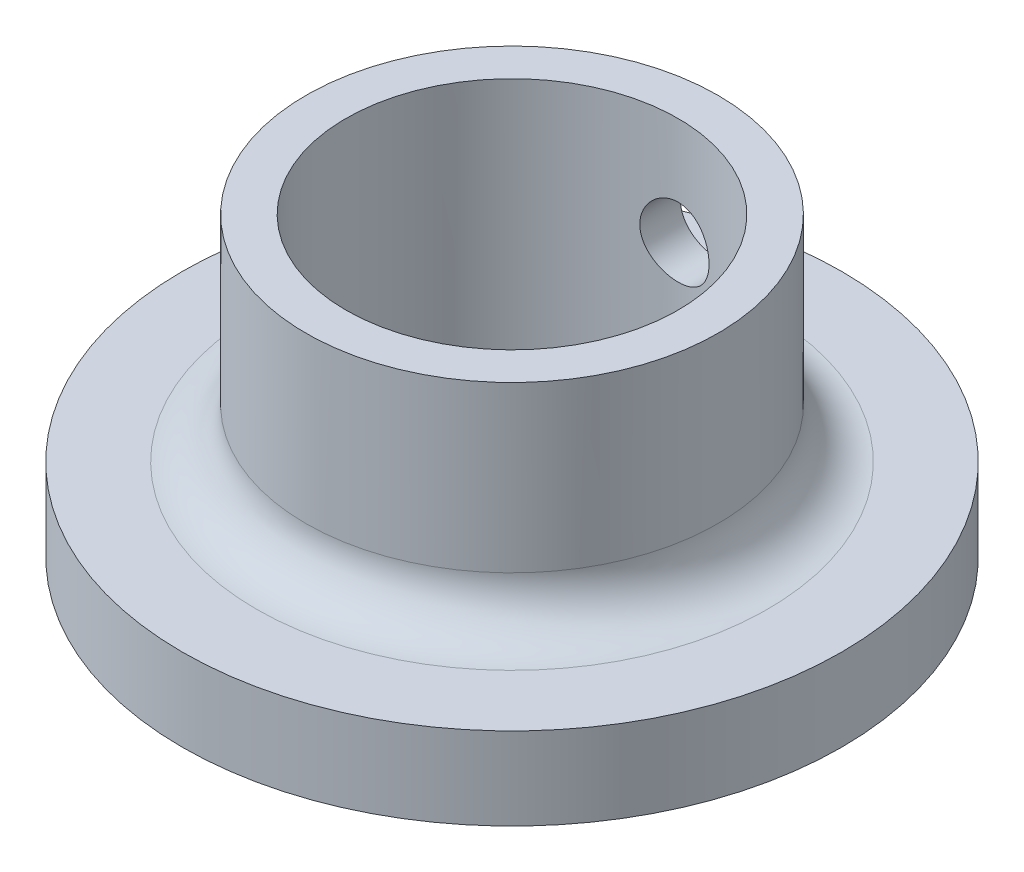
ISO-10303-21;
HEADER;
FILE_DESCRIPTION(('STEP AP214'),'2;1');
FILE_NAME('part.step','',(''),(''),'','','');
FILE_SCHEMA(('AUTOMOTIVE_DESIGN { 1 0 10303 214 1 1 1 1 }'));
ENDSEC;
DATA;
#1=APPLICATION_CONTEXT('core data for automotive mechanical design processes');
#2=APPLICATION_PROTOCOL_DEFINITION('international standard','automotive_design',2000,#1);
#3=PRODUCT_CONTEXT('',#1,'mechanical');
#4=PRODUCT('Part','Part','',(#3));
#5=PRODUCT_RELATED_PRODUCT_CATEGORY('part','',(#4));
#6=PRODUCT_DEFINITION_FORMATION('','',#4);
#7=PRODUCT_DEFINITION_CONTEXT('part definition',#1,'design');
#8=PRODUCT_DEFINITION('design','',#6,#7);
#9=PRODUCT_DEFINITION_SHAPE('','',#8);
#10=(LENGTH_UNIT() NAMED_UNIT(*) SI_UNIT(.MILLI.,.METRE.));
#11=(NAMED_UNIT(*) PLANE_ANGLE_UNIT() SI_UNIT($,.RADIAN.));
#12=(NAMED_UNIT(*) SI_UNIT($,.STERADIAN.) SOLID_ANGLE_UNIT());
#13=UNCERTAINTY_MEASURE_WITH_UNIT(LENGTH_MEASURE(1.E-05),#10,'distance_accuracy_value','');
#14=(GEOMETRIC_REPRESENTATION_CONTEXT(3) GLOBAL_UNCERTAINTY_ASSIGNED_CONTEXT((#13)) GLOBAL_UNIT_ASSIGNED_CONTEXT((#10,
#11,#12)) REPRESENTATION_CONTEXT('',''));
#15=CARTESIAN_POINT('',(0.,0.,0.));
#16=DIRECTION('',(0.,0.,1.));
#17=DIRECTION('',(1.,0.,0.));
#18=AXIS2_PLACEMENT_3D('',#15,#16,#17);
#19=CARTESIAN_POINT('',(0.,0.,0.));
#20=DIRECTION('',(0.,-1.,0.));
#21=DIRECTION('',(0.,0.,-1.));
#22=AXIS2_PLACEMENT_3D('',#19,#20,#21);
#23=PLANE('',#22);
#24=CARTESIAN_POINT('',(0.,0.,0.));
#25=DIRECTION('',(0.,-1.,0.));
#26=DIRECTION('',(0.,0.,-1.));
#27=AXIS2_PLACEMENT_3D('',#24,#25,#26);
#28=CIRCLE('',#27,12.075);
#29=CARTESIAN_POINT('',(0.,0.,-12.075));
#30=VERTEX_POINT('',#29);
#31=EDGE_CURVE('E49',#30,#30,#28,.F.);
#32=ORIENTED_EDGE('',*,*,#31,.T.);
#33=EDGE_LOOP('',(#32));
#34=FACE_BOUND('',#33,.T.);
#35=CARTESIAN_POINT('',(0.,0.,0.));
#36=DIRECTION('',(0.,-1.,0.));
#37=DIRECTION('',(0.,0.,-1.));
#38=AXIS2_PLACEMENT_3D('',#35,#36,#37);
#39=CIRCLE('',#38,20.);
#40=CARTESIAN_POINT('',(0.,0.,-20.));
#41=VERTEX_POINT('',#40);
#42=EDGE_CURVE('E62',#41,#41,#39,.T.);
#43=ORIENTED_EDGE('',*,*,#42,.T.);
#44=EDGE_LOOP('',(#43));
#45=FACE_BOUND('',#44,.T.);
#46=ADVANCED_FACE('F41',(#34,#45),#23,.T.);
#47=CARTESIAN_POINT('',(0.,0.,0.));
#48=DIRECTION('',(0.,-1.,0.));
#49=DIRECTION('',(0.,0.,-1.));
#50=AXIS2_PLACEMENT_3D('',#47,#48,#49);
#51=CYLINDRICAL_SURFACE('',#50,20.);
#52=CARTESIAN_POINT('',(0.,5.,0.));
#53=DIRECTION('',(0.,-1.,0.));
#54=DIRECTION('',(0.,0.,-1.));
#55=AXIS2_PLACEMENT_3D('',#52,#53,#54);
#56=CIRCLE('',#55,20.);
#57=CARTESIAN_POINT('',(0.,5.,-20.));
#58=VERTEX_POINT('',#57);
#59=EDGE_CURVE('E118',#58,#58,#56,.T.);
#60=ORIENTED_EDGE('',*,*,#59,.T.);
#61=EDGE_LOOP('',(#60));
#62=FACE_BOUND('',#61,.T.);
#63=ORIENTED_EDGE('',*,*,#42,.F.);
#64=EDGE_LOOP('',(#63));
#65=FACE_BOUND('',#64,.T.);
#66=ADVANCED_FACE('F100',(#62,#65),#51,.T.);
#67=CARTESIAN_POINT('',(20.,5.,0.));
#68=DIRECTION('',(0.,1.,0.));
#69=DIRECTION('',(0.,0.,1.));
#70=AXIS2_PLACEMENT_3D('',#67,#68,#69);
#71=PLANE('',#70);
#72=CARTESIAN_POINT('',(0.,5.,0.));
#73=DIRECTION('',(0.,1.,0.));
#74=DIRECTION('',(0.,0.,1.));
#75=AXIS2_PLACEMENT_3D('',#72,#73,#74);
#76=CIRCLE('',#75,15.5);
#77=CARTESIAN_POINT('',(0.,5.,15.5));
#78=VERTEX_POINT('',#77);
#79=EDGE_CURVE('E57',#78,#78,#76,.F.);
#80=ORIENTED_EDGE('',*,*,#79,.T.);
#81=EDGE_LOOP('',(#80));
#82=FACE_BOUND('',#81,.T.);
#83=ORIENTED_EDGE('',*,*,#59,.F.);
#84=EDGE_LOOP('',(#83));
#85=FACE_BOUND('',#84,.T.);
#86=ADVANCED_FACE('F96',(#82,#85),#71,.T.);
#87=CARTESIAN_POINT('',(0.,0.,0.));
#88=DIRECTION('',(0.,-1.,0.));
#89=DIRECTION('',(0.,0.,-1.));
#90=AXIS2_PLACEMENT_3D('',#87,#88,#89);
#91=CYLINDRICAL_SURFACE('',#90,12.5);
#92=CARTESIAN_POINT('',(0.,8.,0.));
#93=DIRECTION('',(0.,1.,0.));
#94=DIRECTION('',(0.,0.,1.));
#95=AXIS2_PLACEMENT_3D('',#92,#93,#94);
#96=CIRCLE('',#95,12.5);
#97=CARTESIAN_POINT('',(0.,8.,12.5));
#98=VERTEX_POINT('',#97);
#99=EDGE_CURVE('E53',#98,#98,#96,.T.);
#100=ORIENTED_EDGE('',*,*,#99,.T.);
#101=EDGE_LOOP('',(#100));
#102=FACE_BOUND('',#101,.T.);
#103=CARTESIAN_POINT('',(0.,13.6,-12.5));
#104=CARTESIAN_POINT('',(0.117074540941583,13.5999953180553,-12.4999979850335));
#105=CARTESIAN_POINT('',(0.234212632199716,13.5901766069683,-12.4983381029509));
#106=CARTESIAN_POINT('',(0.465202514145649,13.5511780612859,-12.4918763522327));
#107=CARTESIAN_POINT('',(0.579051198376305,13.5219805116302,-12.4870716087948));
#108=CARTESIAN_POINT('',(0.800086977510911,13.4451315244666,-12.4748589634518));
#109=CARTESIAN_POINT('',(0.907279472218549,13.3974952783633,-12.4674532049535));
#110=CARTESIAN_POINT('',(1.11213678255482,13.2851610984036,-12.4508524755487));
#111=CARTESIAN_POINT('',(1.20980266668286,13.220465080983,-12.4416577056439));
#112=CARTESIAN_POINT('',(1.39379587010546,13.0751798744619,-12.4223981889712));
#113=CARTESIAN_POINT('',(1.48001729912585,12.9944574787781,-12.4123265773946));
#114=CARTESIAN_POINT('',(1.63775931412675,12.8196976324397,-12.3925009568141));
#115=CARTESIAN_POINT('',(1.70927896467095,12.7256593351712,-12.3827469680529));
#116=CARTESIAN_POINT('',(1.83601257169018,12.5262084324141,-12.364594470401));
#117=CARTESIAN_POINT('',(1.89112163656496,12.4207282998381,-12.3562048303615));
#118=CARTESIAN_POINT('',(1.98279891820649,12.2018435893746,-12.3418262562123));
#119=CARTESIAN_POINT('',(2.01936840805618,12.0884395562172,-12.3358371572672));
#120=CARTESIAN_POINT('',(2.0725944628126,11.8580492702142,-12.3270061457285));
#121=CARTESIAN_POINT('',(2.08943395176936,11.7411064059694,-12.3241353407531));
#122=CARTESIAN_POINT('',(2.10328918829526,11.5060224491766,-12.3217785743232));
#123=CARTESIAN_POINT('',(2.10030636130359,11.3878814433981,-12.3222923694792));
#124=CARTESIAN_POINT('',(2.07475059430712,11.1550617794737,-12.3266203766948));
#125=CARTESIAN_POINT('',(2.05238329577848,11.0403598109225,-12.3303999423564));
#126=CARTESIAN_POINT('',(1.98901630209222,10.8163601313339,-12.3407793831826));
#127=CARTESIAN_POINT('',(1.94801595853479,10.7070626085093,-12.3473793564923));
#128=CARTESIAN_POINT('',(1.8483386819589,10.4963595962553,-12.3626933139212));
#129=CARTESIAN_POINT('',(1.78957649916276,10.394995204354,-12.3714174530176));
#130=CARTESIAN_POINT('',(1.65610409912047,10.2034875221293,-12.3899897206694));
#131=CARTESIAN_POINT('',(1.5813925744949,10.113345152643,-12.3998379413357));
#132=CARTESIAN_POINT('',(1.41702255109378,9.94565011086374,-12.4197008820721));
#133=CARTESIAN_POINT('',(1.32718764769097,9.86827030463231,-12.4297161369439));
#134=CARTESIAN_POINT('',(1.13571717625562,9.72965682310529,-12.4486700613777));
#135=CARTESIAN_POINT('',(1.03408152991189,9.66842325496697,-12.4576087237945));
#136=CARTESIAN_POINT('',(0.821731019759832,9.56382412734602,-12.4734153178499));
#137=CARTESIAN_POINT('',(0.711008411458567,9.52047400292406,-12.4802814593463));
#138=CARTESIAN_POINT('',(0.48371291150413,9.45303360779582,-12.4911550424803));
#139=CARTESIAN_POINT('',(0.367140518112909,9.42894169969883,-12.4951627271492));
#140=CARTESIAN_POINT('',(0.132944289836902,9.40093633942355,-12.4998351161996));
#141=CARTESIAN_POINT('',(0.0153495862377751,9.39678560538175,-12.5005391289215));
#142=CARTESIAN_POINT('',(-0.218854906058311,9.40814757931273,-12.4986325690543));
#143=CARTESIAN_POINT('',(-0.335464733102161,9.42365951811877,-12.4960221261204));
#144=CARTESIAN_POINT('',(-0.563655234102345,9.47370915788391,-12.4878043154549));
#145=CARTESIAN_POINT('',(-0.675262433579276,9.50812922786493,-12.4822154831937));
#146=CARTESIAN_POINT('',(-0.891122190274724,9.59489255685242,-12.4686650466383));
#147=CARTESIAN_POINT('',(-0.995374328589462,9.64723683573086,-12.460703307331));
#148=CARTESIAN_POINT('',(-1.19459420437315,9.7689050596984,-12.4431927503219));
#149=CARTESIAN_POINT('',(-1.2894703229513,9.83837702823736,-12.4336303436623));
#150=CARTESIAN_POINT('',(-1.4663024554819,9.99212515760819,-12.4140197746289));
#151=CARTESIAN_POINT('',(-1.54825751409132,10.0764024121238,-12.4039715764089));
#152=CARTESIAN_POINT('',(-1.69780202073456,10.2584336184309,-12.3843946149788));
#153=CARTESIAN_POINT('',(-1.76523104961379,10.3563201802091,-12.3748724383905));
#154=CARTESIAN_POINT('',(-1.8826886150887,10.5621702425911,-12.3575492411171));
#155=CARTESIAN_POINT('',(-1.93271770964875,10.6701334199269,-12.3497481652444));
#156=CARTESIAN_POINT('',(-2.01371609544458,10.8926260012722,-12.3367999967244));
#157=CARTESIAN_POINT('',(-2.04476485036559,11.0071258043437,-12.3316418539891));
#158=CARTESIAN_POINT('',(-2.08717097092275,11.2398095442261,-12.3245360007327));
#159=CARTESIAN_POINT('',(-2.09853007872247,11.3579931541474,-12.3225880061746));
#160=CARTESIAN_POINT('',(-2.10118528184685,11.5930875183413,-12.3221353831586));
#161=CARTESIAN_POINT('',(-2.09273391533625,11.7099954135861,-12.3235874119411));
#162=CARTESIAN_POINT('',(-2.05655455745537,11.9407004981614,-12.3296761691342));
#163=CARTESIAN_POINT('',(-2.028826631474,12.0544976980426,-12.3343128867418));
#164=CARTESIAN_POINT('',(-1.95497860021921,12.2756511249877,-12.3462319999713));
#165=CARTESIAN_POINT('',(-1.90888057961073,12.3830149087036,-12.3535112178275));
#166=CARTESIAN_POINT('',(-1.79962695250782,12.5885255764082,-12.3698981728838));
#167=CARTESIAN_POINT('',(-1.73647047773233,12.6866719908868,-12.3790060031548));
#168=CARTESIAN_POINT('',(-1.59399285529132,12.872237142184,-12.3981611953516));
#169=CARTESIAN_POINT('',(-1.51448603722987,12.9595123088002,-12.4082185589356));
#170=CARTESIAN_POINT('',(-1.34195587892342,13.1195686547091,-12.4280601392207));
#171=CARTESIAN_POINT('',(-1.24892942498316,13.1923464859549,-12.4378442923783));
#172=CARTESIAN_POINT('',(-1.05122315900057,13.321810428653,-12.4561167915784));
#173=CARTESIAN_POINT('',(-0.946466039067368,13.3783798479589,-12.4645955470165));
#174=CARTESIAN_POINT('',(-0.728835605277911,13.4730308602137,-12.4792085834535));
#175=CARTESIAN_POINT('',(-0.615970475427854,13.5111308028771,-12.4853451901191));
#176=CARTESIAN_POINT('',(-0.41889415955467,13.5595239328767,-12.4932486661438));
#177=CARTESIAN_POINT('',(-0.335872891380583,13.5746780510896,-12.4957668377763));
#178=CARTESIAN_POINT('',(-0.168578718714729,13.5949176814824,-12.4991432155384));
#179=CARTESIAN_POINT('',(-0.0843058363549362,13.6000033714867,-12.5000014509853));
#180=CARTESIAN_POINT('',(0.,13.6,-12.5));
#181=B_SPLINE_CURVE_WITH_KNOTS('',3,(#103,#104,#105,#106,#107,#108,#109,#110,#111,#112,#113,
#114,#115,#116,#117,#118,#119,#120,#121,#122,#123,#124,#125,#126,#127,#128,#129,#130,#131,#132,
#133,#134,#135,#136,#137,#138,#139,#140,#141,#142,#143,#144,#145,#146,#147,#148,#149,#150,#151,
#152,#153,#154,#155,#156,#157,#158,#159,#160,#161,#162,#163,#164,#165,#166,#167,#168,#169,#170,
#171,#172,#173,#174,#175,#176,#177,#178,#179,#180),.UNSPECIFIED.,.T.,.F.,(4,2,2,2,2,2,2,2,2,2,2,
2,2,2,2,2,2,2,2,2,2,2,2,2,2,2,2,2,2,2,2,2,2,2,2,2,2,2,4),(0.,0.35091545150206,0.702152133103424,
1.05310004916493,1.4040085577314,1.75796599821148,2.11194595312561,2.46814213683526,
2.8243138578092,3.17715657348286,3.52997391621859,3.87909356289096,4.22822535929209,
4.57906019983617,4.92992380962344,5.28520652717862,5.64049160256887,5.99608268340195,
6.35164352760911,6.70296286172151,7.05426845330718,7.40341286029033,7.75257713658976,
8.10487183858148,8.45719257594607,8.81322460865947,9.16924522342731,9.52376491632597,
9.87825323929572,10.2282472685808,10.5782401106406,10.9278134519676,11.2774045900494,
11.6312096518684,11.9850963277263,12.3414702192176,12.6974893182942,12.9501893751033,
13.2028849687893),.UNSPECIFIED.);
#182=CARTESIAN_POINT('',(0.,13.6,-12.5));
#183=VERTEX_POINT('',#182);
#184=EDGE_CURVE('E71',#183,#183,#181,.T.);
#185=ORIENTED_EDGE('',*,*,#184,.F.);
#186=EDGE_LOOP('',(#185));
#187=FACE_BOUND('',#186,.T.);
#188=CARTESIAN_POINT('',(0.,18.,0.));
#189=DIRECTION('',(0.,-1.,0.));
#190=DIRECTION('',(0.,0.,-1.));
#191=AXIS2_PLACEMENT_3D('',#188,#189,#190);
#192=CIRCLE('',#191,12.5);
#193=CARTESIAN_POINT('',(0.,18.,-12.5));
#194=VERTEX_POINT('',#193);
#195=EDGE_CURVE('E119',#194,#194,#192,.T.);
#196=ORIENTED_EDGE('',*,*,#195,.T.);
#197=EDGE_LOOP('',(#196));
#198=FACE_BOUND('',#197,.T.);
#199=ADVANCED_FACE('F91',(#102,#187,#198),#91,.T.);
#200=CARTESIAN_POINT('',(12.5,18.,0.));
#201=DIRECTION('',(0.,1.,0.));
#202=DIRECTION('',(0.,0.,1.));
#203=AXIS2_PLACEMENT_3D('',#200,#201,#202);
#204=PLANE('',#203);
#205=CARTESIAN_POINT('',(0.,18.,0.));
#206=DIRECTION('',(0.,1.,0.));
#207=DIRECTION('',(0.,0.,1.));
#208=AXIS2_PLACEMENT_3D('',#205,#206,#207);
#209=CIRCLE('',#208,10.075);
#210=CARTESIAN_POINT('',(0.,18.,10.075));
#211=VERTEX_POINT('',#210);
#212=EDGE_CURVE('E89',#211,#211,#209,.T.);
#213=ORIENTED_EDGE('',*,*,#212,.F.);
#214=EDGE_LOOP('',(#213));
#215=FACE_BOUND('',#214,.T.);
#216=ORIENTED_EDGE('',*,*,#195,.F.);
#217=EDGE_LOOP('',(#216));
#218=FACE_BOUND('',#217,.T.);
#219=ADVANCED_FACE('F95',(#215,#218),#204,.T.);
#220=CARTESIAN_POINT('',(0.,0.,0.));
#221=DIRECTION('',(0.,1.,0.));
#222=DIRECTION('',(0.,0.,1.));
#223=AXIS2_PLACEMENT_3D('',#220,#221,#222);
#224=CYLINDRICAL_SURFACE('',#223,10.075);
#225=CARTESIAN_POINT('',(0.,2.00000000000001,0.));
#226=DIRECTION('',(0.,-1.,0.));
#227=DIRECTION('',(0.,0.,-1.));
#228=AXIS2_PLACEMENT_3D('',#225,#226,#227);
#229=CIRCLE('',#228,10.075);
#230=CARTESIAN_POINT('',(0.,2.00000000000001,-10.075));
#231=VERTEX_POINT('',#230);
#232=EDGE_CURVE('E10',#231,#231,#229,.T.);
#233=ORIENTED_EDGE('',*,*,#232,.T.);
#234=EDGE_LOOP('',(#233));
#235=FACE_BOUND('',#234,.T.);
#236=CARTESIAN_POINT('',(2.1,11.5,-9.85371122978545));
#237=CARTESIAN_POINT('',(2.09999581642676,11.3834251469929,-9.85371357359038));
#238=CARTESIAN_POINT('',(2.09026008491108,11.2667986819607,-9.8558024572179));
#239=CARTESIAN_POINT('',(2.05161130142374,11.0368526661212,-9.86391867155982));
#240=CARTESIAN_POINT('',(2.02268355736105,10.9235357182922,-9.869949019537));
#241=CARTESIAN_POINT('',(1.94659310394366,10.7035685082948,-9.88523619367705));
#242=CARTESIAN_POINT('',(1.89944935265066,10.5969114485509,-9.89448966443529));
#243=CARTESIAN_POINT('',(1.78831809797877,10.3930210824876,-9.91517644161312));
#244=CARTESIAN_POINT('',(1.7243312720972,10.2957873973368,-9.92660966034924));
#245=CARTESIAN_POINT('',(1.58028324614712,10.1120078634797,-9.95056376760984));
#246=CARTESIAN_POINT('',(1.50001272528317,10.0256277252076,-9.96309747136771));
#247=CARTESIAN_POINT('',(1.32612799067947,9.86745601364797,-9.987727791191));
#248=CARTESIAN_POINT('',(1.23251279856574,9.79566551094687,-9.99982437512709));
#249=CARTESIAN_POINT('',(1.03349269204739,9.66806239641558,-10.0223563181326));
#250=CARTESIAN_POINT('',(0.927984194630009,9.61240810461084,-10.032774798291));
#251=CARTESIAN_POINT('',(0.708859621687268,9.51968001405534,-10.0506323411221));
#252=CARTESIAN_POINT('',(0.595244372509999,9.48260432460821,-10.0580717069561));
#253=CARTESIAN_POINT('',(0.364852660528807,9.42860409554456,-10.06904225869));
#254=CARTESIAN_POINT('',(0.248144479556552,9.41139944298642,-10.0726277199102));
#255=CARTESIAN_POINT('',(0.0134469050317818,9.39675490764667,-10.0756741923833));
#256=CARTESIAN_POINT('',(-0.104542353603123,9.3993129633214,-10.0751356338326));
#257=CARTESIAN_POINT('',(-0.336525268497881,9.42391046087142,-10.0700365507056));
#258=CARTESIAN_POINT('',(-0.450552496301935,9.44564809035552,-10.0655383383181));
#259=CARTESIAN_POINT('',(-0.67330437363505,9.50750798677513,-10.0530959527605));
#260=CARTESIAN_POINT('',(-0.782028798213774,9.54763103288961,-10.0451516335441));
#261=CARTESIAN_POINT('',(-0.991939574523927,9.64539683171139,-10.0266080519571));
#262=CARTESIAN_POINT('',(-1.09307002776794,9.70315613259725,-10.0159912129365));
#263=CARTESIAN_POINT('',(-1.28431418735957,9.83446833974099,-9.99327025020543));
#264=CARTESIAN_POINT('',(-1.37442652056045,9.90802321139916,-9.98116594149321));
#265=CARTESIAN_POINT('',(-1.5428693870688,10.0704888553656,-9.95653421732378));
#266=CARTESIAN_POINT('',(-1.62094480688531,10.1596637853315,-9.94400312949569));
#267=CARTESIAN_POINT('',(-1.7610770685656,10.3499691666267,-9.92014618633614));
#268=CARTESIAN_POINT('',(-1.82313355289781,10.4510998847274,-9.90882035790856));
#269=CARTESIAN_POINT('',(-1.92956544200839,10.6628326914476,-9.88864792326446));
#270=CARTESIAN_POINT('',(-1.97389651827377,10.7734576958154,-9.87980754895652));
#271=CARTESIAN_POINT('',(-2.0432653847598,11.0008138488814,-9.86569599681288));
#272=CARTESIAN_POINT('',(-2.06830592724002,11.117544123977,-9.86042430983094));
#273=CARTESIAN_POINT('',(-2.09799531177773,11.3514767624509,-9.85414984158041));
#274=CARTESIAN_POINT('',(-2.10301390325743,11.4686301767586,-9.85306966520508));
#275=CARTESIAN_POINT('',(-2.09351457167461,11.7020999004866,-9.85509231926563));
#276=CARTESIAN_POINT('',(-2.07899785860727,11.8184162613046,-9.85819489062676));
#277=CARTESIAN_POINT('',(-2.03115967097287,12.0456477033971,-9.86816071213727));
#278=CARTESIAN_POINT('',(-1.99803842932166,12.1566068568467,-9.87498389636768));
#279=CARTESIAN_POINT('',(-1.91414665817526,12.371400944739,-9.8915865663123));
#280=CARTESIAN_POINT('',(-1.86337456945725,12.4752352488232,-9.90136631319042));
#281=CARTESIAN_POINT('',(-1.74479522451807,12.6744422558532,-9.92295236533317));
#282=CARTESIAN_POINT('',(-1.67675818537515,12.7696752396777,-9.93478526497128));
#283=CARTESIAN_POINT('',(-1.52588406832942,12.9475076020587,-9.95907264636942));
#284=CARTESIAN_POINT('',(-1.44304532929822,13.0301055607099,-9.97152719778146));
#285=CARTESIAN_POINT('',(-1.26325353374548,13.1817397358147,-9.99590749489016));
#286=CARTESIAN_POINT('',(-1.16608689257106,13.250525026679,-10.0078208544725));
#287=CARTESIAN_POINT('',(-0.961362414737332,13.370795097949,-10.0295557065947));
#288=CARTESIAN_POINT('',(-0.853805037752131,13.4222806432246,-10.0393772916107));
#289=CARTESIAN_POINT('',(-0.631988185255254,13.5061311276185,-10.0557693635601));
#290=CARTESIAN_POINT('',(-0.517773431721522,13.5386104103449,-10.0623592530104));
#291=CARTESIAN_POINT('',(-0.285357255274763,13.5838865394034,-10.0716289536001));
#292=CARTESIAN_POINT('',(-0.167156358105854,13.5966859710734,-10.0743092783358));
#293=CARTESIAN_POINT('',(0.0674866165527428,13.6021318224781,-10.0754443372867));
#294=CARTESIAN_POINT('',(0.183919745752206,13.5951543255325,-10.0739779281296));
#295=CARTESIAN_POINT('',(0.413915186094492,13.5620795377807,-10.0671514690693));
#296=CARTESIAN_POINT('',(0.527477539884908,13.5359825311825,-10.0617914770434));
#297=CARTESIAN_POINT('',(0.74824849509313,13.4655825584252,-10.0477839314519));
#298=CARTESIAN_POINT('',(0.855473252150999,13.4213283904423,-10.0391451942881));
#299=CARTESIAN_POINT('',(1.0610278241286,13.3159197449081,-10.0195068947911));
#300=CARTESIAN_POINT('',(1.15935686267451,13.2547637941387,-10.0085071266811));
#301=CARTESIAN_POINT('',(1.34617749600847,13.1160375353285,-9.98511187107568));
#302=CARTESIAN_POINT('',(1.43446816822345,13.0382001535702,-9.97269542980798));
#303=CARTESIAN_POINT('',(1.59686360947345,12.8688649737008,-9.94798547375893));
#304=CARTESIAN_POINT('',(1.67096499075263,12.7773639225864,-9.93569198899636));
#305=CARTESIAN_POINT('',(1.80372110427304,12.5819916100102,-9.91245798748949));
#306=CARTESIAN_POINT('',(1.86218164991702,12.4779861727819,-9.90153530027808));
#307=CARTESIAN_POINT('',(1.96070276424721,12.2614260242849,-9.88250004941659));
#308=CARTESIAN_POINT('',(2.00077953592195,12.1488789437804,-9.87438501273168));
#309=CARTESIAN_POINT('',(2.05389358799797,11.9467806208174,-9.86345155016));
#310=CARTESIAN_POINT('',(2.07115159382213,11.8583582542005,-9.85982226397237));
#311=CARTESIAN_POINT('',(2.09420618359278,11.6799674707896,-9.85495124719417));
#312=CARTESIAN_POINT('',(2.10000322983805,11.5899991165035,-9.8537094203011));
#313=CARTESIAN_POINT('',(2.1,11.5,-9.85371122978545));
#314=B_SPLINE_CURVE_WITH_KNOTS('',3,(#236,#237,#238,#239,#240,#241,#242,#243,#244,#245,#246,
#247,#248,#249,#250,#251,#252,#253,#254,#255,#256,#257,#258,#259,#260,#261,#262,#263,#264,#265,
#266,#267,#268,#269,#270,#271,#272,#273,#274,#275,#276,#277,#278,#279,#280,#281,#282,#283,#284,
#285,#286,#287,#288,#289,#290,#291,#292,#293,#294,#295,#296,#297,#298,#299,#300,#301,#302,#303,
#304,#305,#306,#307,#308,#309,#310,#311,#312,#313),.UNSPECIFIED.,.T.,.F.,(4,2,2,2,2,2,2,2,2,2,2,
2,2,2,2,2,2,2,2,2,2,2,2,2,2,2,2,2,2,2,2,2,2,2,2,2,2,2,4),(0.,0.349394896504198,
0.699057574929461,1.04835732261244,1.397643022178,1.75174105557067,2.1058650632756,
2.46335428984067,2.82080712825817,3.17315713270616,3.52547038231774,3.87233653127501,
4.21921738187382,4.5684420945499,4.91771028551924,5.27358535808089,5.62946837284148,
5.98623591154663,6.34295253933193,6.69305024280504,7.04312626261098,7.38950482344515,
7.73591399009951,8.08720044570008,8.43852634939313,8.79574970810142,9.15295727089308,
9.50799313612943,9.86298235639415,10.2112665490872,10.5595455647044,10.9068946331799,
11.2542739873588,11.6076972432571,11.9612047755926,12.3189165410738,12.6763124198921,
12.9460661417548,13.2158089823852),.UNSPECIFIED.);
#315=CARTESIAN_POINT('',(2.1,11.5,-9.85371122978545));
#316=VERTEX_POINT('',#315);
#317=EDGE_CURVE('E63',#316,#316,#314,.T.);
#318=ORIENTED_EDGE('',*,*,#317,.T.);
#319=EDGE_LOOP('',(#318));
#320=FACE_BOUND('',#319,.T.);
#321=ORIENTED_EDGE('',*,*,#212,.T.);
#322=EDGE_LOOP('',(#321));
#323=FACE_BOUND('',#322,.T.);
#324=ADVANCED_FACE('F73',(#235,#320,#323),#224,.F.);
#325=CARTESIAN_POINT('',(0.,11.5,-20.));
#326=DIRECTION('',(0.,0.,1.));
#327=DIRECTION('',(1.,0.,0.));
#328=AXIS2_PLACEMENT_3D('',#325,#326,#327);
#329=CYLINDRICAL_SURFACE('',#328,2.1);
#330=ORIENTED_EDGE('',*,*,#184,.T.);
#331=EDGE_LOOP('',(#330));
#332=FACE_BOUND('',#331,.T.);
#333=ORIENTED_EDGE('',*,*,#317,.F.);
#334=EDGE_LOOP('',(#333));
#335=FACE_BOUND('',#334,.T.);
#336=ADVANCED_FACE('F76',(#332,#335),#329,.F.);
#337=CARTESIAN_POINT('',(0.,8.,0.));
#338=DIRECTION('',(0.,1.,0.));
#339=DIRECTION('',(0.,0.,1.));
#340=AXIS2_PLACEMENT_3D('',#337,#338,#339);
#341=TOROIDAL_SURFACE('',#340,15.5,3.);
#342=ORIENTED_EDGE('',*,*,#99,.F.);
#343=EDGE_LOOP('',(#342));
#344=FACE_BOUND('',#343,.T.);
#345=ORIENTED_EDGE('',*,*,#79,.F.);
#346=EDGE_LOOP('',(#345));
#347=FACE_BOUND('',#346,.T.);
#348=ADVANCED_FACE('F79',(#344,#347),#341,.F.);
#349=CARTESIAN_POINT('',(0.,0.,0.));
#350=DIRECTION('',(0.,-1.,0.));
#351=DIRECTION('',(0.,0.,-1.));
#352=AXIS2_PLACEMENT_3D('',#349,#350,#351);
#353=CONICAL_SURFACE('',#352,12.075,0.785398163397447);
#354=ORIENTED_EDGE('',*,*,#232,.F.);
#355=EDGE_LOOP('',(#354));
#356=FACE_BOUND('',#355,.T.);
#357=ORIENTED_EDGE('',*,*,#31,.F.);
#358=EDGE_LOOP('',(#357));
#359=FACE_BOUND('',#358,.T.);
#360=ADVANCED_FACE('F44',(#356,#359),#353,.F.);
#361=CLOSED_SHELL('',(#46,#66,#86,#199,#219,#324,#336,#348,#360));
#362=MANIFOLD_SOLID_BREP('B2',#361);
#363=ADVANCED_BREP_SHAPE_REPRESENTATION('',(#18,#362),#14);
#364=SHAPE_DEFINITION_REPRESENTATION(#9,#363);
ENDSEC;
END-ISO-10303-21;
